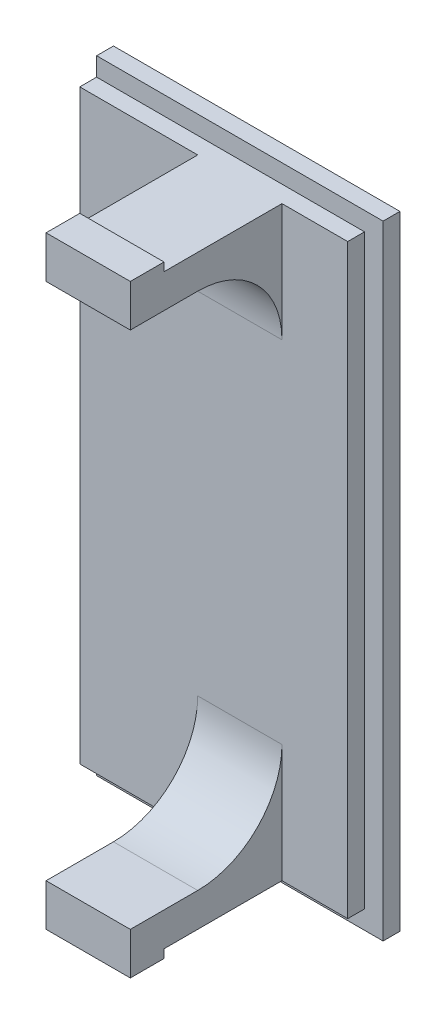
ISO-10303-21;
HEADER;
FILE_DESCRIPTION(('STEP AP214'),'2;1');
FILE_NAME('part.step','',(''),(''),'','','');
FILE_SCHEMA(('AUTOMOTIVE_DESIGN { 1 0 10303 214 1 1 1 1 }'));
ENDSEC;
DATA;
#1=APPLICATION_CONTEXT('core data for automotive mechanical design processes');
#2=APPLICATION_PROTOCOL_DEFINITION('international standard','automotive_design',2000,#1);
#3=PRODUCT_CONTEXT('',#1,'mechanical');
#4=PRODUCT('Part','Part','',(#3));
#5=PRODUCT_RELATED_PRODUCT_CATEGORY('part','',(#4));
#6=PRODUCT_DEFINITION_FORMATION('','',#4);
#7=PRODUCT_DEFINITION_CONTEXT('part definition',#1,'design');
#8=PRODUCT_DEFINITION('design','',#6,#7);
#9=PRODUCT_DEFINITION_SHAPE('','',#8);
#10=(LENGTH_UNIT() NAMED_UNIT(*) SI_UNIT(.MILLI.,.METRE.));
#11=(NAMED_UNIT(*) PLANE_ANGLE_UNIT() SI_UNIT($,.RADIAN.));
#12=(NAMED_UNIT(*) SI_UNIT($,.STERADIAN.) SOLID_ANGLE_UNIT());
#13=UNCERTAINTY_MEASURE_WITH_UNIT(LENGTH_MEASURE(1.E-05),#10,'distance_accuracy_value','');
#14=(GEOMETRIC_REPRESENTATION_CONTEXT(3) GLOBAL_UNCERTAINTY_ASSIGNED_CONTEXT((#13)) GLOBAL_UNIT_ASSIGNED_CONTEXT((#10,
#11,#12)) REPRESENTATION_CONTEXT('',''));
#15=CARTESIAN_POINT('',(0.,0.,0.));
#16=DIRECTION('',(0.,0.,1.));
#17=DIRECTION('',(1.,0.,0.));
#18=AXIS2_PLACEMENT_3D('',#15,#16,#17);
#19=CARTESIAN_POINT('',(-17.,-34.8,4.));
#20=DIRECTION('',(0.,1.,0.));
#21=DIRECTION('',(0.,0.,1.));
#22=AXIS2_PLACEMENT_3D('',#19,#20,#21);
#23=PLANE('',#22);
#24=DIRECTION('',(-1.,0.,0.));
#25=VECTOR('',#24,1.);
#26=CARTESIAN_POINT('',(-2.99999999999999,-34.8,18.));
#27=LINE('',#26,#25);
#28=CARTESIAN_POINT('',(7.00000000000001,-34.8,18.));
#29=VERTEX_POINT('',#28);
#30=CARTESIAN_POINT('',(-2.99999999999999,-34.8,18.));
#31=VERTEX_POINT('',#30);
#32=EDGE_CURVE('E196',#29,#31,#27,.T.);
#33=ORIENTED_EDGE('',*,*,#32,.T.);
#34=DIRECTION('',(0.,0.,-1.));
#35=VECTOR('',#34,1.);
#36=CARTESIAN_POINT('',(-2.99999999999999,-34.8,22.));
#37=LINE('',#36,#35);
#38=CARTESIAN_POINT('',(-2.99999999999999,-34.8,4.));
#39=VERTEX_POINT('',#38);
#40=EDGE_CURVE('E209',#31,#39,#37,.T.);
#41=ORIENTED_EDGE('',*,*,#40,.T.);
#42=DIRECTION('',(1.,0.,0.));
#43=VECTOR('',#42,1.);
#44=CARTESIAN_POINT('',(-17.,-34.8,4.));
#45=LINE('',#44,#43);
#46=CARTESIAN_POINT('',(-17.,-34.8,4.));
#47=VERTEX_POINT('',#46);
#48=EDGE_CURVE('E303',#47,#39,#45,.T.);
#49=ORIENTED_EDGE('',*,*,#48,.F.);
#50=DIRECTION('',(0.,0.,-1.));
#51=VECTOR('',#50,1.);
#52=CARTESIAN_POINT('',(-17.,-34.8,4.));
#53=LINE('',#52,#51);
#54=CARTESIAN_POINT('',(-17.,-34.8,2.));
#55=VERTEX_POINT('',#54);
#56=EDGE_CURVE('E345',#47,#55,#53,.T.);
#57=ORIENTED_EDGE('',*,*,#56,.T.);
#58=DIRECTION('',(1.,0.,0.));
#59=VECTOR('',#58,1.);
#60=CARTESIAN_POINT('',(-17.,-34.8,2.));
#61=LINE('',#60,#59);
#62=CARTESIAN_POINT('',(14.8,-34.8,2.));
#63=VERTEX_POINT('',#62);
#64=EDGE_CURVE('E411',#55,#63,#61,.T.);
#65=ORIENTED_EDGE('',*,*,#64,.T.);
#66=DIRECTION('',(0.,0.,-1.));
#67=VECTOR('',#66,1.);
#68=CARTESIAN_POINT('',(14.8,-34.8,4.));
#69=LINE('',#68,#67);
#70=CARTESIAN_POINT('',(14.8,-34.8,4.));
#71=VERTEX_POINT('',#70);
#72=EDGE_CURVE('E342',#71,#63,#69,.T.);
#73=ORIENTED_EDGE('',*,*,#72,.F.);
#74=CARTESIAN_POINT('',(7.00000000000001,-34.8,4.));
#75=VERTEX_POINT('',#74);
#76=EDGE_CURVE('E310',#75,#71,#45,.T.);
#77=ORIENTED_EDGE('',*,*,#76,.F.);
#78=DIRECTION('',(0.,0.,-1.));
#79=VECTOR('',#78,1.);
#80=CARTESIAN_POINT('',(7.00000000000001,-34.8,22.));
#81=LINE('',#80,#79);
#82=EDGE_CURVE('E252',#29,#75,#81,.T.);
#83=ORIENTED_EDGE('',*,*,#82,.F.);
#84=EDGE_LOOP('',(#33,#41,#49,#57,#65,#73,#77,#83));
#85=FACE_BOUND('',#84,.T.);
#86=ADVANCED_FACE('F35',(#85),#23,.F.);
#87=CARTESIAN_POINT('',(0.,0.,4.));
#88=DIRECTION('',(0.,0.,1.));
#89=DIRECTION('',(1.,0.,0.));
#90=AXIS2_PLACEMENT_3D('',#87,#88,#89);
#91=PLANE('',#90);
#92=DIRECTION('',(0.,1.,0.));
#93=VECTOR('',#92,1.);
#94=CARTESIAN_POINT('',(7.,34.8,4.));
#95=LINE('',#94,#93);
#96=CARTESIAN_POINT('',(7.,20.8,4.));
#97=VERTEX_POINT('',#96);
#98=CARTESIAN_POINT('',(7.,34.8,4.));
#99=VERTEX_POINT('',#98);
#100=EDGE_CURVE('E260',#97,#99,#95,.T.);
#101=ORIENTED_EDGE('',*,*,#100,.F.);
#102=DIRECTION('',(1.,0.,0.));
#103=VECTOR('',#102,1.);
#104=CARTESIAN_POINT('',(0.,20.8,4.));
#105=LINE('',#104,#103);
#106=CARTESIAN_POINT('',(-3.,20.8,4.));
#107=VERTEX_POINT('',#106);
#108=EDGE_CURVE('E287',#97,#107,#105,.F.);
#109=ORIENTED_EDGE('',*,*,#108,.T.);
#110=DIRECTION('',(0.,-1.,0.));
#111=VECTOR('',#110,1.);
#112=CARTESIAN_POINT('',(-3.,34.8,4.));
#113=LINE('',#112,#111);
#114=CARTESIAN_POINT('',(-3.,34.8,4.));
#115=VERTEX_POINT('',#114);
#116=EDGE_CURVE('E255',#115,#107,#113,.T.);
#117=ORIENTED_EDGE('',*,*,#116,.F.);
#118=DIRECTION('',(-1.,0.,0.));
#119=VECTOR('',#118,1.);
#120=CARTESIAN_POINT('',(-17.,34.8,4.));
#121=LINE('',#120,#119);
#122=CARTESIAN_POINT('',(-17.,34.8,4.));
#123=VERTEX_POINT('',#122);
#124=EDGE_CURVE('E312',#115,#123,#121,.T.);
#125=ORIENTED_EDGE('',*,*,#124,.T.);
#126=DIRECTION('',(0.,-1.,0.));
#127=VECTOR('',#126,1.);
#128=CARTESIAN_POINT('',(-17.,34.8,4.));
#129=LINE('',#128,#127);
#130=EDGE_CURVE('E305',#123,#47,#129,.T.);
#131=ORIENTED_EDGE('',*,*,#130,.T.);
#132=ORIENTED_EDGE('',*,*,#48,.T.);
#133=DIRECTION('',(0.,-1.,0.));
#134=VECTOR('',#133,1.);
#135=CARTESIAN_POINT('',(-2.99999999999999,-34.8,4.));
#136=LINE('',#135,#134);
#137=CARTESIAN_POINT('',(-2.99999999999999,-20.8,4.));
#138=VERTEX_POINT('',#137);
#139=EDGE_CURVE('E235',#138,#39,#136,.T.);
#140=ORIENTED_EDGE('',*,*,#139,.F.);
#141=DIRECTION('',(-1.,0.,0.));
#142=VECTOR('',#141,1.);
#143=CARTESIAN_POINT('',(0.,-20.8,4.));
#144=LINE('',#143,#142);
#145=CARTESIAN_POINT('',(7.00000000000001,-20.8,4.));
#146=VERTEX_POINT('',#145);
#147=EDGE_CURVE('E283',#138,#146,#144,.F.);
#148=ORIENTED_EDGE('',*,*,#147,.T.);
#149=DIRECTION('',(0.,1.,0.));
#150=VECTOR('',#149,1.);
#151=CARTESIAN_POINT('',(7.00000000000001,-34.8,4.));
#152=LINE('',#151,#150);
#153=EDGE_CURVE('E241',#75,#146,#152,.T.);
#154=ORIENTED_EDGE('',*,*,#153,.F.);
#155=ORIENTED_EDGE('',*,*,#76,.T.);
#156=DIRECTION('',(0.,1.,0.));
#157=VECTOR('',#156,1.);
#158=CARTESIAN_POINT('',(14.8,34.8,4.));
#159=LINE('',#158,#157);
#160=CARTESIAN_POINT('',(14.8,34.8,4.));
#161=VERTEX_POINT('',#160);
#162=EDGE_CURVE('E309',#71,#161,#159,.T.);
#163=ORIENTED_EDGE('',*,*,#162,.T.);
#164=EDGE_CURVE('E324',#161,#99,#121,.T.);
#165=ORIENTED_EDGE('',*,*,#164,.T.);
#166=EDGE_LOOP('',(#101,#109,#117,#125,#131,#132,#140,#148,#154,#155,#163,#165));
#167=FACE_BOUND('',#166,.T.);
#168=ADVANCED_FACE('F300',(#167),#91,.T.);
#169=CARTESIAN_POINT('',(-17.,37.,2.));
#170=DIRECTION('',(1.,0.,0.));
#171=DIRECTION('',(0.,1.,0.));
#172=AXIS2_PLACEMENT_3D('',#169,#170,#171);
#173=PLANE('',#172);
#174=DIRECTION('',(0.,-1.,0.));
#175=VECTOR('',#174,1.);
#176=CARTESIAN_POINT('',(-17.,37.,0.));
#177=LINE('',#176,#175);
#178=CARTESIAN_POINT('',(-17.,37.,0.));
#179=VERTEX_POINT('',#178);
#180=CARTESIAN_POINT('',(-17.,-37.,0.));
#181=VERTEX_POINT('',#180);
#182=EDGE_CURVE('E375',#179,#181,#177,.T.);
#183=ORIENTED_EDGE('',*,*,#182,.T.);
#184=DIRECTION('',(0.,0.,-1.));
#185=VECTOR('',#184,1.);
#186=CARTESIAN_POINT('',(-17.,-37.,2.));
#187=LINE('',#186,#185);
#188=CARTESIAN_POINT('',(-17.,-37.,2.));
#189=VERTEX_POINT('',#188);
#190=EDGE_CURVE('E284',#189,#181,#187,.T.);
#191=ORIENTED_EDGE('',*,*,#190,.F.);
#192=DIRECTION('',(0.,-1.,0.));
#193=VECTOR('',#192,1.);
#194=CARTESIAN_POINT('',(-17.,37.,2.));
#195=LINE('',#194,#193);
#196=EDGE_CURVE('E352',#55,#189,#195,.T.);
#197=ORIENTED_EDGE('',*,*,#196,.F.);
#198=ORIENTED_EDGE('',*,*,#56,.F.);
#199=ORIENTED_EDGE('',*,*,#130,.F.);
#200=DIRECTION('',(0.,0.,-1.));
#201=VECTOR('',#200,1.);
#202=CARTESIAN_POINT('',(-17.,34.8,4.));
#203=LINE('',#202,#201);
#204=CARTESIAN_POINT('',(-17.,34.8,2.));
#205=VERTEX_POINT('',#204);
#206=EDGE_CURVE('E327',#123,#205,#203,.T.);
#207=ORIENTED_EDGE('',*,*,#206,.T.);
#208=CARTESIAN_POINT('',(-17.,37.,2.));
#209=VERTEX_POINT('',#208);
#210=EDGE_CURVE('E355',#209,#205,#195,.T.);
#211=ORIENTED_EDGE('',*,*,#210,.F.);
#212=DIRECTION('',(0.,0.,-1.));
#213=VECTOR('',#212,1.);
#214=CARTESIAN_POINT('',(-17.,37.,2.));
#215=LINE('',#214,#213);
#216=EDGE_CURVE('E365',#209,#179,#215,.T.);
#217=ORIENTED_EDGE('',*,*,#216,.T.);
#218=EDGE_LOOP('',(#183,#191,#197,#198,#199,#207,#211,#217));
#219=FACE_BOUND('',#218,.T.);
#220=ADVANCED_FACE('F407',(#219),#173,.F.);
#221=CARTESIAN_POINT('',(-17.,-37.,2.));
#222=DIRECTION('',(0.,1.,0.));
#223=DIRECTION('',(0.,0.,1.));
#224=AXIS2_PLACEMENT_3D('',#221,#222,#223);
#225=PLANE('',#224);
#226=DIRECTION('',(1.,0.,0.));
#227=VECTOR('',#226,1.);
#228=CARTESIAN_POINT('',(-17.,-37.,0.));
#229=LINE('',#228,#227);
#230=CARTESIAN_POINT('',(17.,-37.,0.));
#231=VERTEX_POINT('',#230);
#232=EDGE_CURVE('E373',#181,#231,#229,.T.);
#233=ORIENTED_EDGE('',*,*,#232,.T.);
#234=DIRECTION('',(0.,0.,-1.));
#235=VECTOR('',#234,1.);
#236=CARTESIAN_POINT('',(17.,-37.,2.));
#237=LINE('',#236,#235);
#238=CARTESIAN_POINT('',(17.,-37.,2.));
#239=VERTEX_POINT('',#238);
#240=EDGE_CURVE('E359',#239,#231,#237,.T.);
#241=ORIENTED_EDGE('',*,*,#240,.F.);
#242=DIRECTION('',(1.,0.,0.));
#243=VECTOR('',#242,1.);
#244=CARTESIAN_POINT('',(-17.,-37.,2.));
#245=LINE('',#244,#243);
#246=EDGE_CURVE('E348',#189,#239,#245,.T.);
#247=ORIENTED_EDGE('',*,*,#246,.F.);
#248=ORIENTED_EDGE('',*,*,#190,.T.);
#249=EDGE_LOOP('',(#233,#241,#247,#248));
#250=FACE_BOUND('',#249,.T.);
#251=ADVANCED_FACE('F388',(#250),#225,.F.);
#252=CARTESIAN_POINT('',(17.,37.,2.));
#253=DIRECTION('',(-1.,0.,0.));
#254=DIRECTION('',(0.,0.,1.));
#255=AXIS2_PLACEMENT_3D('',#252,#253,#254);
#256=PLANE('',#255);
#257=DIRECTION('',(0.,1.,0.));
#258=VECTOR('',#257,1.);
#259=CARTESIAN_POINT('',(17.,37.,0.));
#260=LINE('',#259,#258);
#261=CARTESIAN_POINT('',(17.,37.,0.));
#262=VERTEX_POINT('',#261);
#263=EDGE_CURVE('E371',#231,#262,#260,.T.);
#264=ORIENTED_EDGE('',*,*,#263,.T.);
#265=DIRECTION('',(0.,0.,-1.));
#266=VECTOR('',#265,1.);
#267=CARTESIAN_POINT('',(17.,37.,2.));
#268=LINE('',#267,#266);
#269=CARTESIAN_POINT('',(17.,37.,2.));
#270=VERTEX_POINT('',#269);
#271=EDGE_CURVE('E362',#270,#262,#268,.T.);
#272=ORIENTED_EDGE('',*,*,#271,.F.);
#273=DIRECTION('',(0.,1.,0.));
#274=VECTOR('',#273,1.);
#275=CARTESIAN_POINT('',(17.,37.,2.));
#276=LINE('',#275,#274);
#277=EDGE_CURVE('E378',#239,#270,#276,.T.);
#278=ORIENTED_EDGE('',*,*,#277,.F.);
#279=ORIENTED_EDGE('',*,*,#240,.T.);
#280=EDGE_LOOP('',(#264,#272,#278,#279));
#281=FACE_BOUND('',#280,.T.);
#282=ADVANCED_FACE('F391',(#281),#256,.F.);
#283=CARTESIAN_POINT('',(-17.,37.,2.));
#284=DIRECTION('',(0.,-1.,0.));
#285=DIRECTION('',(0.,0.,-1.));
#286=AXIS2_PLACEMENT_3D('',#283,#284,#285);
#287=PLANE('',#286);
#288=DIRECTION('',(-1.,0.,0.));
#289=VECTOR('',#288,1.);
#290=CARTESIAN_POINT('',(-17.,37.,0.));
#291=LINE('',#290,#289);
#292=EDGE_CURVE('E369',#262,#179,#291,.T.);
#293=ORIENTED_EDGE('',*,*,#292,.T.);
#294=ORIENTED_EDGE('',*,*,#216,.F.);
#295=DIRECTION('',(-1.,0.,0.));
#296=VECTOR('',#295,1.);
#297=CARTESIAN_POINT('',(-17.,37.,2.));
#298=LINE('',#297,#296);
#299=EDGE_CURVE('E368',#270,#209,#298,.T.);
#300=ORIENTED_EDGE('',*,*,#299,.F.);
#301=ORIENTED_EDGE('',*,*,#271,.T.);
#302=EDGE_LOOP('',(#293,#294,#300,#301));
#303=FACE_BOUND('',#302,.T.);
#304=ADVANCED_FACE('F396',(#303),#287,.F.);
#305=CARTESIAN_POINT('',(0.,0.,2.));
#306=DIRECTION('',(0.,0.,1.));
#307=DIRECTION('',(1.,0.,0.));
#308=AXIS2_PLACEMENT_3D('',#305,#306,#307);
#309=PLANE('',#308);
#310=DIRECTION('',(-1.,0.,0.));
#311=VECTOR('',#310,1.);
#312=CARTESIAN_POINT('',(-17.,34.8,2.));
#313=LINE('',#312,#311);
#314=CARTESIAN_POINT('',(14.8,34.8,2.));
#315=VERTEX_POINT('',#314);
#316=EDGE_CURVE('E333',#315,#205,#313,.T.);
#317=ORIENTED_EDGE('',*,*,#316,.F.);
#318=DIRECTION('',(0.,1.,0.));
#319=VECTOR('',#318,1.);
#320=CARTESIAN_POINT('',(14.8,34.8,2.));
#321=LINE('',#320,#319);
#322=EDGE_CURVE('E318',#63,#315,#321,.T.);
#323=ORIENTED_EDGE('',*,*,#322,.F.);
#324=ORIENTED_EDGE('',*,*,#64,.F.);
#325=ORIENTED_EDGE('',*,*,#196,.T.);
#326=ORIENTED_EDGE('',*,*,#246,.T.);
#327=ORIENTED_EDGE('',*,*,#277,.T.);
#328=ORIENTED_EDGE('',*,*,#299,.T.);
#329=ORIENTED_EDGE('',*,*,#210,.T.);
#330=EDGE_LOOP('',(#317,#323,#324,#325,#326,#327,#328,#329));
#331=FACE_BOUND('',#330,.T.);
#332=ADVANCED_FACE('F384',(#331),#309,.T.);
#333=CARTESIAN_POINT('',(0.,0.,0.));
#334=DIRECTION('',(0.,0.,1.));
#335=DIRECTION('',(1.,0.,0.));
#336=AXIS2_PLACEMENT_3D('',#333,#334,#335);
#337=PLANE('',#336);
#338=ORIENTED_EDGE('',*,*,#182,.F.);
#339=ORIENTED_EDGE('',*,*,#292,.F.);
#340=ORIENTED_EDGE('',*,*,#263,.F.);
#341=ORIENTED_EDGE('',*,*,#232,.F.);
#342=EDGE_LOOP('',(#338,#339,#340,#341));
#343=FACE_BOUND('',#342,.T.);
#344=ADVANCED_FACE('F463',(#343),#337,.F.);
#345=CARTESIAN_POINT('',(14.8,34.8,4.));
#346=DIRECTION('',(-1.,0.,0.));
#347=DIRECTION('',(0.,-1.,0.));
#348=AXIS2_PLACEMENT_3D('',#345,#346,#347);
#349=PLANE('',#348);
#350=ORIENTED_EDGE('',*,*,#322,.T.);
#351=DIRECTION('',(0.,0.,-1.));
#352=VECTOR('',#351,1.);
#353=CARTESIAN_POINT('',(14.8,34.8,4.));
#354=LINE('',#353,#352);
#355=EDGE_CURVE('E332',#161,#315,#354,.T.);
#356=ORIENTED_EDGE('',*,*,#355,.F.);
#357=ORIENTED_EDGE('',*,*,#162,.F.);
#358=ORIENTED_EDGE('',*,*,#72,.T.);
#359=EDGE_LOOP('',(#350,#356,#357,#358));
#360=FACE_BOUND('',#359,.T.);
#361=ADVANCED_FACE('F459',(#360),#349,.F.);
#362=CARTESIAN_POINT('',(-17.,34.8,4.));
#363=DIRECTION('',(0.,-1.,0.));
#364=DIRECTION('',(0.,0.,-1.));
#365=AXIS2_PLACEMENT_3D('',#362,#363,#364);
#366=PLANE('',#365);
#367=DIRECTION('',(0.,0.,-1.));
#368=VECTOR('',#367,1.);
#369=CARTESIAN_POINT('',(-3.,34.8,22.));
#370=LINE('',#369,#368);
#371=CARTESIAN_POINT('',(-3.,34.8,18.));
#372=VERTEX_POINT('',#371);
#373=EDGE_CURVE('E264',#372,#115,#370,.T.);
#374=ORIENTED_EDGE('',*,*,#373,.F.);
#375=DIRECTION('',(1.,0.,0.));
#376=VECTOR('',#375,1.);
#377=CARTESIAN_POINT('',(-3.,34.8,18.));
#378=LINE('',#377,#376);
#379=CARTESIAN_POINT('',(7.,34.8,18.));
#380=VERTEX_POINT('',#379);
#381=EDGE_CURVE('E220',#372,#380,#378,.T.);
#382=ORIENTED_EDGE('',*,*,#381,.T.);
#383=DIRECTION('',(0.,0.,-1.));
#384=VECTOR('',#383,1.);
#385=CARTESIAN_POINT('',(7.,34.8,22.));
#386=LINE('',#385,#384);
#387=EDGE_CURVE('E277',#380,#99,#386,.T.);
#388=ORIENTED_EDGE('',*,*,#387,.T.);
#389=ORIENTED_EDGE('',*,*,#164,.F.);
#390=ORIENTED_EDGE('',*,*,#355,.T.);
#391=ORIENTED_EDGE('',*,*,#316,.T.);
#392=ORIENTED_EDGE('',*,*,#206,.F.);
#393=ORIENTED_EDGE('',*,*,#124,.F.);
#394=EDGE_LOOP('',(#374,#382,#388,#389,#390,#391,#392,#393));
#395=FACE_BOUND('',#394,.T.);
#396=ADVANCED_FACE('F403',(#395),#366,.F.);
#397=CARTESIAN_POINT('',(-3.,34.8,22.));
#398=DIRECTION('',(1.,0.,0.));
#399=DIRECTION('',(0.,0.,-1.));
#400=AXIS2_PLACEMENT_3D('',#397,#398,#399);
#401=PLANE('',#400);
#402=ORIENTED_EDGE('',*,*,#116,.T.);
#403=CARTESIAN_POINT('',(-3.,20.8,14.));
#404=DIRECTION('',(1.,0.,0.));
#405=DIRECTION('',(0.,0.,-1.));
#406=AXIS2_PLACEMENT_3D('',#403,#404,#405);
#407=CIRCLE('',#406,10.);
#408=CARTESIAN_POINT('',(-3.,30.8,14.));
#409=VERTEX_POINT('',#408);
#410=EDGE_CURVE('E295',#107,#409,#407,.T.);
#411=ORIENTED_EDGE('',*,*,#410,.T.);
#412=DIRECTION('',(0.,0.,-1.));
#413=VECTOR('',#412,1.);
#414=CARTESIAN_POINT('',(-3.,30.8,22.));
#415=LINE('',#414,#413);
#416=CARTESIAN_POINT('',(-3.,30.8,22.));
#417=VERTEX_POINT('',#416);
#418=EDGE_CURVE('E412',#417,#409,#415,.T.);
#419=ORIENTED_EDGE('',*,*,#418,.F.);
#420=DIRECTION('',(0.,-1.,0.));
#421=VECTOR('',#420,1.);
#422=CARTESIAN_POINT('',(-3.,34.8,22.));
#423=LINE('',#422,#421);
#424=CARTESIAN_POINT('',(-3.,35.8,22.));
#425=VERTEX_POINT('',#424);
#426=EDGE_CURVE('E256',#425,#417,#423,.T.);
#427=ORIENTED_EDGE('',*,*,#426,.F.);
#428=DIRECTION('',(0.,0.,1.));
#429=VECTOR('',#428,1.);
#430=CARTESIAN_POINT('',(-3.,35.8,18.));
#431=LINE('',#430,#429);
#432=CARTESIAN_POINT('',(-3.,35.8,18.));
#433=VERTEX_POINT('',#432);
#434=EDGE_CURVE('E232',#433,#425,#431,.T.);
#435=ORIENTED_EDGE('',*,*,#434,.F.);
#436=DIRECTION('',(0.,-1.,0.));
#437=VECTOR('',#436,1.);
#438=CARTESIAN_POINT('',(-3.,34.8,18.));
#439=LINE('',#438,#437);
#440=EDGE_CURVE('E217',#433,#372,#439,.T.);
#441=ORIENTED_EDGE('',*,*,#440,.T.);
#442=ORIENTED_EDGE('',*,*,#373,.T.);
#443=EDGE_LOOP('',(#402,#411,#419,#427,#435,#441,#442));
#444=FACE_BOUND('',#443,.T.);
#445=ADVANCED_FACE('F435',(#444),#401,.F.);
#446=CARTESIAN_POINT('',(-3.,30.8,22.));
#447=DIRECTION('',(0.,1.,0.));
#448=DIRECTION('',(0.,0.,1.));
#449=AXIS2_PLACEMENT_3D('',#446,#447,#448);
#450=PLANE('',#449);
#451=ORIENTED_EDGE('',*,*,#418,.T.);
#452=DIRECTION('',(1.,0.,0.));
#453=VECTOR('',#452,1.);
#454=CARTESIAN_POINT('',(-3.,30.8,14.));
#455=LINE('',#454,#453);
#456=CARTESIAN_POINT('',(7.,30.8,14.));
#457=VERTEX_POINT('',#456);
#458=EDGE_CURVE('E280',#409,#457,#455,.T.);
#459=ORIENTED_EDGE('',*,*,#458,.T.);
#460=DIRECTION('',(0.,0.,-1.));
#461=VECTOR('',#460,1.);
#462=CARTESIAN_POINT('',(7.,30.8,22.));
#463=LINE('',#462,#461);
#464=CARTESIAN_POINT('',(7.,30.8,22.));
#465=VERTEX_POINT('',#464);
#466=EDGE_CURVE('E267',#465,#457,#463,.T.);
#467=ORIENTED_EDGE('',*,*,#466,.F.);
#468=DIRECTION('',(1.,0.,0.));
#469=VECTOR('',#468,1.);
#470=CARTESIAN_POINT('',(-3.,30.8,22.));
#471=LINE('',#470,#469);
#472=EDGE_CURVE('E259',#417,#465,#471,.T.);
#473=ORIENTED_EDGE('',*,*,#472,.F.);
#474=EDGE_LOOP('',(#451,#459,#467,#473));
#475=FACE_BOUND('',#474,.T.);
#476=ADVANCED_FACE('F424',(#475),#450,.F.);
#477=CARTESIAN_POINT('',(7.,34.8,22.));
#478=DIRECTION('',(-1.,0.,0.));
#479=DIRECTION('',(0.,0.,1.));
#480=AXIS2_PLACEMENT_3D('',#477,#478,#479);
#481=PLANE('',#480);
#482=ORIENTED_EDGE('',*,*,#100,.T.);
#483=ORIENTED_EDGE('',*,*,#387,.F.);
#484=DIRECTION('',(0.,1.,0.));
#485=VECTOR('',#484,1.);
#486=CARTESIAN_POINT('',(7.,34.8,18.));
#487=LINE('',#486,#485);
#488=CARTESIAN_POINT('',(7.,35.8,18.));
#489=VERTEX_POINT('',#488);
#490=EDGE_CURVE('E223',#380,#489,#487,.T.);
#491=ORIENTED_EDGE('',*,*,#490,.T.);
#492=DIRECTION('',(0.,0.,1.));
#493=VECTOR('',#492,1.);
#494=CARTESIAN_POINT('',(7.,35.8,18.));
#495=LINE('',#494,#493);
#496=CARTESIAN_POINT('',(7.,35.8,22.));
#497=VERTEX_POINT('',#496);
#498=EDGE_CURVE('E229',#489,#497,#495,.T.);
#499=ORIENTED_EDGE('',*,*,#498,.T.);
#500=DIRECTION('',(0.,1.,0.));
#501=VECTOR('',#500,1.);
#502=CARTESIAN_POINT('',(7.,34.8,22.));
#503=LINE('',#502,#501);
#504=EDGE_CURVE('E262',#465,#497,#503,.T.);
#505=ORIENTED_EDGE('',*,*,#504,.F.);
#506=ORIENTED_EDGE('',*,*,#466,.T.);
#507=CARTESIAN_POINT('',(7.,20.8,14.));
#508=DIRECTION('',(-1.,0.,0.));
#509=DIRECTION('',(0.,0.,1.));
#510=AXIS2_PLACEMENT_3D('',#507,#508,#509);
#511=CIRCLE('',#510,10.);
#512=EDGE_CURVE('E292',#457,#97,#511,.T.);
#513=ORIENTED_EDGE('',*,*,#512,.T.);
#514=EDGE_LOOP('',(#482,#483,#491,#499,#505,#506,#513));
#515=FACE_BOUND('',#514,.T.);
#516=ADVANCED_FACE('F422',(#515),#481,.F.);
#517=CARTESIAN_POINT('',(0.,0.,22.));
#518=DIRECTION('',(0.,0.,1.));
#519=DIRECTION('',(1.,0.,0.));
#520=AXIS2_PLACEMENT_3D('',#517,#518,#519);
#521=PLANE('',#520);
#522=ORIENTED_EDGE('',*,*,#426,.T.);
#523=ORIENTED_EDGE('',*,*,#472,.T.);
#524=ORIENTED_EDGE('',*,*,#504,.T.);
#525=DIRECTION('',(-1.,0.,0.));
#526=VECTOR('',#525,1.);
#527=CARTESIAN_POINT('',(-3.,35.8,22.));
#528=LINE('',#527,#526);
#529=EDGE_CURVE('E215',#497,#425,#528,.T.);
#530=ORIENTED_EDGE('',*,*,#529,.T.);
#531=EDGE_LOOP('',(#522,#523,#524,#530));
#532=FACE_BOUND('',#531,.T.);
#533=ADVANCED_FACE('F440',(#532),#521,.T.);
#534=CARTESIAN_POINT('',(-2.99999999999999,-34.8,22.));
#535=DIRECTION('',(1.,0.,0.));
#536=DIRECTION('',(0.,1.,0.));
#537=AXIS2_PLACEMENT_3D('',#534,#535,#536);
#538=PLANE('',#537);
#539=ORIENTED_EDGE('',*,*,#139,.T.);
#540=ORIENTED_EDGE('',*,*,#40,.F.);
#541=DIRECTION('',(0.,-1.,0.));
#542=VECTOR('',#541,1.);
#543=CARTESIAN_POINT('',(-2.99999999999999,-34.8,18.));
#544=LINE('',#543,#542);
#545=CARTESIAN_POINT('',(-2.99999999999999,-35.8,18.));
#546=VERTEX_POINT('',#545);
#547=EDGE_CURVE('E202',#31,#546,#544,.T.);
#548=ORIENTED_EDGE('',*,*,#547,.T.);
#549=DIRECTION('',(0.,0.,1.));
#550=VECTOR('',#549,1.);
#551=CARTESIAN_POINT('',(-2.99999999999999,-35.8,18.));
#552=LINE('',#551,#550);
#553=CARTESIAN_POINT('',(-2.99999999999999,-35.8,22.));
#554=VERTEX_POINT('',#553);
#555=EDGE_CURVE('E185',#546,#554,#552,.T.);
#556=ORIENTED_EDGE('',*,*,#555,.T.);
#557=DIRECTION('',(0.,-1.,0.));
#558=VECTOR('',#557,1.);
#559=CARTESIAN_POINT('',(-2.99999999999999,-34.8,22.));
#560=LINE('',#559,#558);
#561=CARTESIAN_POINT('',(-2.99999999999999,-30.8,22.));
#562=VERTEX_POINT('',#561);
#563=EDGE_CURVE('E238',#562,#554,#560,.T.);
#564=ORIENTED_EDGE('',*,*,#563,.F.);
#565=DIRECTION('',(0.,0.,-1.));
#566=VECTOR('',#565,1.);
#567=CARTESIAN_POINT('',(-2.99999999999999,-30.8,22.));
#568=LINE('',#567,#566);
#569=CARTESIAN_POINT('',(-2.99999999999999,-30.8,14.));
#570=VERTEX_POINT('',#569);
#571=EDGE_CURVE('E245',#562,#570,#568,.T.);
#572=ORIENTED_EDGE('',*,*,#571,.T.);
#573=CARTESIAN_POINT('',(-2.99999999999999,-20.8,14.));
#574=DIRECTION('',(1.,0.,0.));
#575=DIRECTION('',(0.,1.,0.));
#576=AXIS2_PLACEMENT_3D('',#573,#574,#575);
#577=CIRCLE('',#576,10.);
#578=EDGE_CURVE('E43',#570,#138,#577,.T.);
#579=ORIENTED_EDGE('',*,*,#578,.T.);
#580=EDGE_LOOP('',(#539,#540,#548,#556,#564,#572,#579));
#581=FACE_BOUND('',#580,.T.);
#582=ADVANCED_FACE('F208',(#581),#538,.F.);
#583=CARTESIAN_POINT('',(7.00000000000001,-34.8,22.));
#584=DIRECTION('',(-1.,0.,0.));
#585=DIRECTION('',(0.,0.,1.));
#586=AXIS2_PLACEMENT_3D('',#583,#584,#585);
#587=PLANE('',#586);
#588=ORIENTED_EDGE('',*,*,#153,.T.);
#589=CARTESIAN_POINT('',(7.00000000000001,-20.8,14.));
#590=DIRECTION('',(-1.,0.,0.));
#591=DIRECTION('',(0.,0.,1.));
#592=AXIS2_PLACEMENT_3D('',#589,#590,#591);
#593=CIRCLE('',#592,10.);
#594=CARTESIAN_POINT('',(7.00000000000001,-30.8,14.));
#595=VERTEX_POINT('',#594);
#596=EDGE_CURVE('E11',#146,#595,#593,.T.);
#597=ORIENTED_EDGE('',*,*,#596,.T.);
#598=DIRECTION('',(0.,0.,-1.));
#599=VECTOR('',#598,1.);
#600=CARTESIAN_POINT('',(7.00000000000001,-30.8,22.));
#601=LINE('',#600,#599);
#602=CARTESIAN_POINT('',(7.00000000000001,-30.8,22.));
#603=VERTEX_POINT('',#602);
#604=EDGE_CURVE('E250',#603,#595,#601,.T.);
#605=ORIENTED_EDGE('',*,*,#604,.F.);
#606=DIRECTION('',(0.,1.,0.));
#607=VECTOR('',#606,1.);
#608=CARTESIAN_POINT('',(7.00000000000001,-34.8,22.));
#609=LINE('',#608,#607);
#610=CARTESIAN_POINT('',(7.00000000000001,-35.8,22.));
#611=VERTEX_POINT('',#610);
#612=EDGE_CURVE('E240',#611,#603,#609,.T.);
#613=ORIENTED_EDGE('',*,*,#612,.F.);
#614=DIRECTION('',(0.,0.,1.));
#615=VECTOR('',#614,1.);
#616=CARTESIAN_POINT('',(7.00000000000001,-35.8,18.));
#617=LINE('',#616,#615);
#618=CARTESIAN_POINT('',(7.00000000000001,-35.8,18.));
#619=VERTEX_POINT('',#618);
#620=EDGE_CURVE('E195',#619,#611,#617,.T.);
#621=ORIENTED_EDGE('',*,*,#620,.F.);
#622=DIRECTION('',(0.,1.,0.));
#623=VECTOR('',#622,1.);
#624=CARTESIAN_POINT('',(7.00000000000001,-34.8,18.));
#625=LINE('',#624,#623);
#626=EDGE_CURVE('E204',#619,#29,#625,.T.);
#627=ORIENTED_EDGE('',*,*,#626,.T.);
#628=ORIENTED_EDGE('',*,*,#82,.T.);
#629=EDGE_LOOP('',(#588,#597,#605,#613,#621,#627,#628));
#630=FACE_BOUND('',#629,.T.);
#631=ADVANCED_FACE('F448',(#630),#587,.F.);
#632=CARTESIAN_POINT('',(-2.99999999999999,-30.8,22.));
#633=DIRECTION('',(0.,-1.,0.));
#634=DIRECTION('',(0.,0.,-1.));
#635=AXIS2_PLACEMENT_3D('',#632,#633,#634);
#636=PLANE('',#635);
#637=ORIENTED_EDGE('',*,*,#604,.T.);
#638=DIRECTION('',(-1.,0.,0.));
#639=VECTOR('',#638,1.);
#640=CARTESIAN_POINT('',(-2.99999999999999,-30.8,14.));
#641=LINE('',#640,#639);
#642=EDGE_CURVE('E290',#595,#570,#641,.T.);
#643=ORIENTED_EDGE('',*,*,#642,.T.);
#644=ORIENTED_EDGE('',*,*,#571,.F.);
#645=DIRECTION('',(-1.,0.,0.));
#646=VECTOR('',#645,1.);
#647=CARTESIAN_POINT('',(-2.99999999999999,-30.8,22.));
#648=LINE('',#647,#646);
#649=EDGE_CURVE('E243',#603,#562,#648,.T.);
#650=ORIENTED_EDGE('',*,*,#649,.F.);
#651=EDGE_LOOP('',(#637,#643,#644,#650));
#652=FACE_BOUND('',#651,.T.);
#653=ADVANCED_FACE('F492',(#652),#636,.F.);
#654=CARTESIAN_POINT('',(0.,0.,22.));
#655=DIRECTION('',(0.,0.,-1.));
#656=DIRECTION('',(-1.,0.,0.));
#657=AXIS2_PLACEMENT_3D('',#654,#655,#656);
#658=PLANE('',#657);
#659=ORIENTED_EDGE('',*,*,#563,.T.);
#660=DIRECTION('',(1.,0.,0.));
#661=VECTOR('',#660,1.);
#662=CARTESIAN_POINT('',(-2.99999999999999,-35.8,22.));
#663=LINE('',#662,#661);
#664=EDGE_CURVE('E191',#554,#611,#663,.T.);
#665=ORIENTED_EDGE('',*,*,#664,.T.);
#666=ORIENTED_EDGE('',*,*,#612,.T.);
#667=ORIENTED_EDGE('',*,*,#649,.T.);
#668=EDGE_LOOP('',(#659,#665,#666,#667));
#669=FACE_BOUND('',#668,.T.);
#670=ADVANCED_FACE('F489',(#669),#658,.F.);
#671=CARTESIAN_POINT('',(-3.,35.8,18.));
#672=DIRECTION('',(0.,1.,0.));
#673=DIRECTION('',(0.,0.,1.));
#674=AXIS2_PLACEMENT_3D('',#671,#672,#673);
#675=PLANE('',#674);
#676=ORIENTED_EDGE('',*,*,#529,.F.);
#677=ORIENTED_EDGE('',*,*,#498,.F.);
#678=DIRECTION('',(-1.,0.,0.));
#679=VECTOR('',#678,1.);
#680=CARTESIAN_POINT('',(-3.,35.8,18.));
#681=LINE('',#680,#679);
#682=EDGE_CURVE('E226',#489,#433,#681,.T.);
#683=ORIENTED_EDGE('',*,*,#682,.T.);
#684=ORIENTED_EDGE('',*,*,#434,.T.);
#685=EDGE_LOOP('',(#676,#677,#683,#684));
#686=FACE_BOUND('',#685,.T.);
#687=ADVANCED_FACE('F438',(#686),#675,.T.);
#688=CARTESIAN_POINT('',(0.,0.,18.));
#689=DIRECTION('',(0.,0.,-1.));
#690=DIRECTION('',(-1.,0.,0.));
#691=AXIS2_PLACEMENT_3D('',#688,#689,#690);
#692=PLANE('',#691);
#693=ORIENTED_EDGE('',*,*,#440,.F.);
#694=ORIENTED_EDGE('',*,*,#682,.F.);
#695=ORIENTED_EDGE('',*,*,#490,.F.);
#696=ORIENTED_EDGE('',*,*,#381,.F.);
#697=EDGE_LOOP('',(#693,#694,#695,#696));
#698=FACE_BOUND('',#697,.T.);
#699=ADVANCED_FACE('F433',(#698),#692,.T.);
#700=CARTESIAN_POINT('',(-2.99999999999999,-35.8,18.));
#701=DIRECTION('',(0.,-1.,0.));
#702=DIRECTION('',(0.,0.,-1.));
#703=AXIS2_PLACEMENT_3D('',#700,#701,#702);
#704=PLANE('',#703);
#705=ORIENTED_EDGE('',*,*,#664,.F.);
#706=ORIENTED_EDGE('',*,*,#555,.F.);
#707=DIRECTION('',(1.,0.,0.));
#708=VECTOR('',#707,1.);
#709=CARTESIAN_POINT('',(-2.99999999999999,-35.8,18.));
#710=LINE('',#709,#708);
#711=EDGE_CURVE('E189',#546,#619,#710,.T.);
#712=ORIENTED_EDGE('',*,*,#711,.T.);
#713=ORIENTED_EDGE('',*,*,#620,.T.);
#714=EDGE_LOOP('',(#705,#706,#712,#713));
#715=FACE_BOUND('',#714,.T.);
#716=ADVANCED_FACE('F187',(#715),#704,.T.);
#717=CARTESIAN_POINT('',(0.,0.,18.));
#718=DIRECTION('',(0.,0.,1.));
#719=DIRECTION('',(1.,0.,0.));
#720=AXIS2_PLACEMENT_3D('',#717,#718,#719);
#721=PLANE('',#720);
#722=ORIENTED_EDGE('',*,*,#547,.F.);
#723=ORIENTED_EDGE('',*,*,#32,.F.);
#724=ORIENTED_EDGE('',*,*,#626,.F.);
#725=ORIENTED_EDGE('',*,*,#711,.F.);
#726=EDGE_LOOP('',(#722,#723,#724,#725));
#727=FACE_BOUND('',#726,.T.);
#728=ADVANCED_FACE('F200',(#727),#721,.F.);
#729=CARTESIAN_POINT('',(-3.,20.8,14.));
#730=DIRECTION('',(1.,0.,0.));
#731=DIRECTION('',(0.,0.,-1.));
#732=AXIS2_PLACEMENT_3D('',#729,#730,#731);
#733=CYLINDRICAL_SURFACE('',#732,10.);
#734=ORIENTED_EDGE('',*,*,#410,.F.);
#735=ORIENTED_EDGE('',*,*,#108,.F.);
#736=ORIENTED_EDGE('',*,*,#512,.F.);
#737=ORIENTED_EDGE('',*,*,#458,.F.);
#738=EDGE_LOOP('',(#734,#735,#736,#737));
#739=FACE_BOUND('',#738,.T.);
#740=ADVANCED_FACE('F427',(#739),#733,.F.);
#741=CARTESIAN_POINT('',(-2.99999999999999,-20.8,14.));
#742=DIRECTION('',(-1.,0.,0.));
#743=DIRECTION('',(0.,0.,1.));
#744=AXIS2_PLACEMENT_3D('',#741,#742,#743);
#745=CYLINDRICAL_SURFACE('',#744,10.);
#746=ORIENTED_EDGE('',*,*,#596,.F.);
#747=ORIENTED_EDGE('',*,*,#147,.F.);
#748=ORIENTED_EDGE('',*,*,#578,.F.);
#749=ORIENTED_EDGE('',*,*,#642,.F.);
#750=EDGE_LOOP('',(#746,#747,#748,#749));
#751=FACE_BOUND('',#750,.T.);
#752=ADVANCED_FACE('F37',(#751),#745,.F.);
#753=CLOSED_SHELL('',(#86,#168,#220,#251,#282,#304,#332,#344,#361,#396,#445,#476,#516,#533,#582,
#631,#653,#670,#687,#699,#716,#728,#740,#752));
#754=MANIFOLD_SOLID_BREP('B2',#753);
#755=ADVANCED_BREP_SHAPE_REPRESENTATION('',(#18,#754),#14);
#756=SHAPE_DEFINITION_REPRESENTATION(#9,#755);
ENDSEC;
END-ISO-10303-21;
